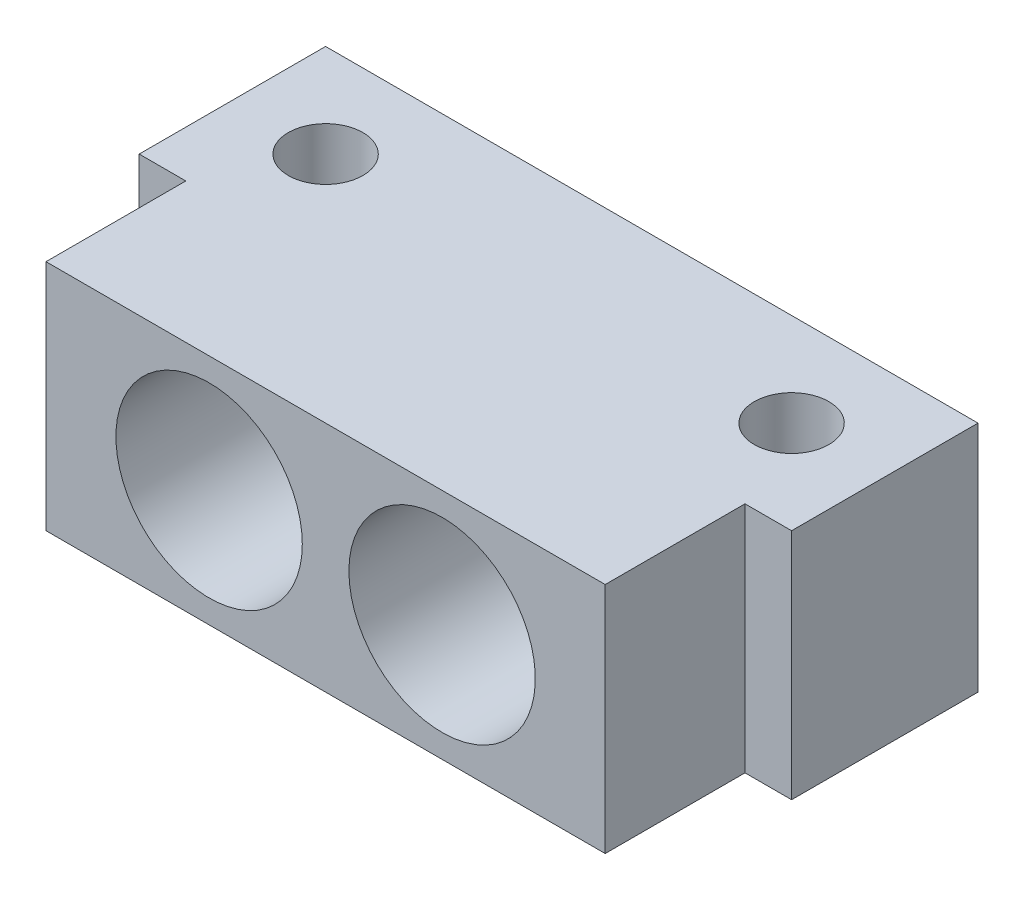
ISO-10303-21;
HEADER;
FILE_DESCRIPTION(('STEP AP214'),'2;1');
FILE_NAME('part.step','',(''),(''),'','','');
FILE_SCHEMA(('AUTOMOTIVE_DESIGN { 1 0 10303 214 1 1 1 1 }'));
ENDSEC;
DATA;
#1=APPLICATION_CONTEXT('core data for automotive mechanical design processes');
#2=APPLICATION_PROTOCOL_DEFINITION('international standard','automotive_design',2000,#1);
#3=PRODUCT_CONTEXT('',#1,'mechanical');
#4=PRODUCT('Part','Part','',(#3));
#5=PRODUCT_RELATED_PRODUCT_CATEGORY('part','',(#4));
#6=PRODUCT_DEFINITION_FORMATION('','',#4);
#7=PRODUCT_DEFINITION_CONTEXT('part definition',#1,'design');
#8=PRODUCT_DEFINITION('design','',#6,#7);
#9=PRODUCT_DEFINITION_SHAPE('','',#8);
#10=(LENGTH_UNIT() NAMED_UNIT(*) SI_UNIT(.MILLI.,.METRE.));
#11=(NAMED_UNIT(*) PLANE_ANGLE_UNIT() SI_UNIT($,.RADIAN.));
#12=(NAMED_UNIT(*) SI_UNIT($,.STERADIAN.) SOLID_ANGLE_UNIT());
#13=UNCERTAINTY_MEASURE_WITH_UNIT(LENGTH_MEASURE(1.E-05),#10,'distance_accuracy_value','');
#14=(GEOMETRIC_REPRESENTATION_CONTEXT(3) GLOBAL_UNCERTAINTY_ASSIGNED_CONTEXT((#13)) GLOBAL_UNIT_ASSIGNED_CONTEXT((#10,
#11,#12)) REPRESENTATION_CONTEXT('',''));
#15=CARTESIAN_POINT('',(0.,0.,0.));
#16=DIRECTION('',(0.,0.,1.));
#17=DIRECTION('',(1.,0.,0.));
#18=AXIS2_PLACEMENT_3D('',#15,#16,#17);
#19=CARTESIAN_POINT('',(0.,25.,0.));
#20=DIRECTION('',(0.,-1.,0.));
#21=DIRECTION('',(0.,0.,-1.));
#22=AXIS2_PLACEMENT_3D('',#19,#20,#21);
#23=PLANE('',#22);
#24=DIRECTION('',(0.,0.,-1.));
#25=VECTOR('',#24,1.);
#26=CARTESIAN_POINT('',(35.,25.,10.));
#27=LINE('',#26,#25);
#28=CARTESIAN_POINT('',(35.,25.,10.));
#29=VERTEX_POINT('',#28);
#30=CARTESIAN_POINT('',(35.,25.,-10.));
#31=VERTEX_POINT('',#30);
#32=EDGE_CURVE('E164',#29,#31,#27,.T.);
#33=ORIENTED_EDGE('',*,*,#32,.T.);
#34=DIRECTION('',(-1.,0.,0.));
#35=VECTOR('',#34,1.);
#36=CARTESIAN_POINT('',(-35.,25.,-10.));
#37=LINE('',#36,#35);
#38=CARTESIAN_POINT('',(-35.,25.,-10.));
#39=VERTEX_POINT('',#38);
#40=EDGE_CURVE('E100',#31,#39,#37,.T.);
#41=ORIENTED_EDGE('',*,*,#40,.T.);
#42=DIRECTION('',(0.,0.,1.));
#43=VECTOR('',#42,1.);
#44=CARTESIAN_POINT('',(-35.,25.,10.));
#45=LINE('',#44,#43);
#46=CARTESIAN_POINT('',(-35.,25.,10.));
#47=VERTEX_POINT('',#46);
#48=EDGE_CURVE('E185',#39,#47,#45,.T.);
#49=ORIENTED_EDGE('',*,*,#48,.T.);
#50=DIRECTION('',(1.,0.,0.));
#51=VECTOR('',#50,1.);
#52=CARTESIAN_POINT('',(-35.,25.,10.));
#53=LINE('',#52,#51);
#54=CARTESIAN_POINT('',(-30.,25.,10.));
#55=VERTEX_POINT('',#54);
#56=EDGE_CURVE('E199',#47,#55,#53,.T.);
#57=ORIENTED_EDGE('',*,*,#56,.T.);
#58=DIRECTION('',(0.,0.,1.));
#59=VECTOR('',#58,1.);
#60=CARTESIAN_POINT('',(-30.,25.,10.));
#61=LINE('',#60,#59);
#62=CARTESIAN_POINT('',(-30.,25.,25.));
#63=VERTEX_POINT('',#62);
#64=EDGE_CURVE('E119',#55,#63,#61,.T.);
#65=ORIENTED_EDGE('',*,*,#64,.T.);
#66=DIRECTION('',(1.,0.,0.));
#67=VECTOR('',#66,1.);
#68=CARTESIAN_POINT('',(-30.,25.,25.));
#69=LINE('',#68,#67);
#70=CARTESIAN_POINT('',(30.,25.,25.));
#71=VERTEX_POINT('',#70);
#72=EDGE_CURVE('E113',#63,#71,#69,.T.);
#73=ORIENTED_EDGE('',*,*,#72,.T.);
#74=DIRECTION('',(0.,0.,-1.));
#75=VECTOR('',#74,1.);
#76=CARTESIAN_POINT('',(30.,25.,10.));
#77=LINE('',#76,#75);
#78=CARTESIAN_POINT('',(30.,25.,10.));
#79=VERTEX_POINT('',#78);
#80=EDGE_CURVE('E117',#71,#79,#77,.T.);
#81=ORIENTED_EDGE('',*,*,#80,.T.);
#82=DIRECTION('',(1.,0.,0.));
#83=VECTOR('',#82,1.);
#84=CARTESIAN_POINT('',(30.,25.,10.));
#85=LINE('',#84,#83);
#86=EDGE_CURVE('E57',#79,#29,#85,.T.);
#87=ORIENTED_EDGE('',*,*,#86,.T.);
#88=EDGE_LOOP('',(#33,#41,#49,#57,#65,#73,#81,#87));
#89=FACE_BOUND('',#88,.T.);
#90=CARTESIAN_POINT('',(-25.,25.,0.));
#91=DIRECTION('',(0.,1.,0.));
#92=DIRECTION('',(0.,0.,1.));
#93=AXIS2_PLACEMENT_3D('',#90,#91,#92);
#94=CIRCLE('',#93,4.);
#95=CARTESIAN_POINT('',(-25.,25.,4.));
#96=VERTEX_POINT('',#95);
#97=EDGE_CURVE('E146',#96,#96,#94,.T.);
#98=ORIENTED_EDGE('',*,*,#97,.F.);
#99=EDGE_LOOP('',(#98));
#100=FACE_BOUND('',#99,.T.);
#101=CARTESIAN_POINT('',(25.,25.,0.));
#102=DIRECTION('',(0.,1.,0.));
#103=DIRECTION('',(0.,0.,-1.));
#104=AXIS2_PLACEMENT_3D('',#101,#102,#103);
#105=CIRCLE('',#104,4.);
#106=CARTESIAN_POINT('',(25.,25.,-4.00000000000001));
#107=VERTEX_POINT('',#106);
#108=EDGE_CURVE('E213',#107,#107,#105,.T.);
#109=ORIENTED_EDGE('',*,*,#108,.F.);
#110=EDGE_LOOP('',(#109));
#111=FACE_BOUND('',#110,.T.);
#112=ADVANCED_FACE('F39',(#89,#100,#111),#23,.F.);
#113=CARTESIAN_POINT('',(0.,0.,0.));
#114=DIRECTION('',(0.,-1.,0.));
#115=DIRECTION('',(0.,0.,-1.));
#116=AXIS2_PLACEMENT_3D('',#113,#114,#115);
#117=PLANE('',#116);
#118=CARTESIAN_POINT('',(-25.,0.,0.));
#119=DIRECTION('',(0.,1.,0.));
#120=DIRECTION('',(0.,0.,1.));
#121=AXIS2_PLACEMENT_3D('',#118,#119,#120);
#122=CIRCLE('',#121,4.);
#123=CARTESIAN_POINT('',(-25.,0.,4.));
#124=VERTEX_POINT('',#123);
#125=EDGE_CURVE('E209',#124,#124,#122,.T.);
#126=ORIENTED_EDGE('',*,*,#125,.T.);
#127=EDGE_LOOP('',(#126));
#128=FACE_BOUND('',#127,.T.);
#129=DIRECTION('',(0.,0.,-1.));
#130=VECTOR('',#129,1.);
#131=CARTESIAN_POINT('',(35.,0.,10.));
#132=LINE('',#131,#130);
#133=CARTESIAN_POINT('',(35.,0.,10.));
#134=VERTEX_POINT('',#133);
#135=CARTESIAN_POINT('',(35.,0.,-10.));
#136=VERTEX_POINT('',#135);
#137=EDGE_CURVE('E141',#134,#136,#132,.T.);
#138=ORIENTED_EDGE('',*,*,#137,.F.);
#139=DIRECTION('',(1.,0.,0.));
#140=VECTOR('',#139,1.);
#141=CARTESIAN_POINT('',(30.,0.,10.));
#142=LINE('',#141,#140);
#143=CARTESIAN_POINT('',(30.,0.,10.));
#144=VERTEX_POINT('',#143);
#145=EDGE_CURVE('E92',#144,#134,#142,.T.);
#146=ORIENTED_EDGE('',*,*,#145,.F.);
#147=DIRECTION('',(0.,0.,-1.));
#148=VECTOR('',#147,1.);
#149=CARTESIAN_POINT('',(30.,0.,10.));
#150=LINE('',#149,#148);
#151=CARTESIAN_POINT('',(30.,0.,25.));
#152=VERTEX_POINT('',#151);
#153=EDGE_CURVE('E86',#152,#144,#150,.T.);
#154=ORIENTED_EDGE('',*,*,#153,.F.);
#155=DIRECTION('',(1.,0.,0.));
#156=VECTOR('',#155,1.);
#157=CARTESIAN_POINT('',(-30.,0.,25.));
#158=LINE('',#157,#156);
#159=CARTESIAN_POINT('',(-30.,0.,25.));
#160=VERTEX_POINT('',#159);
#161=EDGE_CURVE('E128',#160,#152,#158,.T.);
#162=ORIENTED_EDGE('',*,*,#161,.F.);
#163=DIRECTION('',(0.,0.,1.));
#164=VECTOR('',#163,1.);
#165=CARTESIAN_POINT('',(-30.,0.,10.));
#166=LINE('',#165,#164);
#167=CARTESIAN_POINT('',(-30.,0.,10.));
#168=VERTEX_POINT('',#167);
#169=EDGE_CURVE('E155',#168,#160,#166,.T.);
#170=ORIENTED_EDGE('',*,*,#169,.F.);
#171=DIRECTION('',(1.,0.,0.));
#172=VECTOR('',#171,1.);
#173=CARTESIAN_POINT('',(-35.,0.,10.));
#174=LINE('',#173,#172);
#175=CARTESIAN_POINT('',(-35.,0.,10.));
#176=VERTEX_POINT('',#175);
#177=EDGE_CURVE('E152',#176,#168,#174,.T.);
#178=ORIENTED_EDGE('',*,*,#177,.F.);
#179=DIRECTION('',(0.,0.,1.));
#180=VECTOR('',#179,1.);
#181=CARTESIAN_POINT('',(-35.,0.,10.));
#182=LINE('',#181,#180);
#183=CARTESIAN_POINT('',(-35.,0.,-10.));
#184=VERTEX_POINT('',#183);
#185=EDGE_CURVE('E149',#184,#176,#182,.T.);
#186=ORIENTED_EDGE('',*,*,#185,.F.);
#187=DIRECTION('',(-1.,0.,0.));
#188=VECTOR('',#187,1.);
#189=CARTESIAN_POINT('',(-35.,0.,-10.));
#190=LINE('',#189,#188);
#191=EDGE_CURVE('E145',#136,#184,#190,.T.);
#192=ORIENTED_EDGE('',*,*,#191,.F.);
#193=EDGE_LOOP('',(#138,#146,#154,#162,#170,#178,#186,#192));
#194=FACE_BOUND('',#193,.T.);
#195=CARTESIAN_POINT('',(25.,0.,0.));
#196=DIRECTION('',(0.,1.,0.));
#197=DIRECTION('',(0.,0.,-1.));
#198=AXIS2_PLACEMENT_3D('',#195,#196,#197);
#199=CIRCLE('',#198,4.);
#200=CARTESIAN_POINT('',(25.,0.,-4.00000000000001));
#201=VERTEX_POINT('',#200);
#202=EDGE_CURVE('E217',#201,#201,#199,.T.);
#203=ORIENTED_EDGE('',*,*,#202,.T.);
#204=EDGE_LOOP('',(#203));
#205=FACE_BOUND('',#204,.T.);
#206=ADVANCED_FACE('F189',(#128,#194,#205),#117,.T.);
#207=CARTESIAN_POINT('',(35.,25.,10.));
#208=DIRECTION('',(-1.,0.,0.));
#209=DIRECTION('',(0.,0.,1.));
#210=AXIS2_PLACEMENT_3D('',#207,#208,#209);
#211=PLANE('',#210);
#212=ORIENTED_EDGE('',*,*,#137,.T.);
#213=DIRECTION('',(0.,-1.,0.));
#214=VECTOR('',#213,1.);
#215=CARTESIAN_POINT('',(35.,25.,-10.));
#216=LINE('',#215,#214);
#217=EDGE_CURVE('E11',#31,#136,#216,.T.);
#218=ORIENTED_EDGE('',*,*,#217,.F.);
#219=ORIENTED_EDGE('',*,*,#32,.F.);
#220=DIRECTION('',(0.,-1.,0.));
#221=VECTOR('',#220,1.);
#222=CARTESIAN_POINT('',(35.,25.,10.));
#223=LINE('',#222,#221);
#224=EDGE_CURVE('E137',#29,#134,#223,.T.);
#225=ORIENTED_EDGE('',*,*,#224,.T.);
#226=EDGE_LOOP('',(#212,#218,#219,#225));
#227=FACE_BOUND('',#226,.T.);
#228=ADVANCED_FACE('F41',(#227),#211,.F.);
#229=CARTESIAN_POINT('',(-35.,25.,-10.));
#230=DIRECTION('',(0.,0.,1.));
#231=DIRECTION('',(1.,0.,0.));
#232=AXIS2_PLACEMENT_3D('',#229,#230,#231);
#233=PLANE('',#232);
#234=ORIENTED_EDGE('',*,*,#191,.T.);
#235=DIRECTION('',(0.,-1.,0.));
#236=VECTOR('',#235,1.);
#237=CARTESIAN_POINT('',(-35.,25.,-10.));
#238=LINE('',#237,#236);
#239=EDGE_CURVE('E49',#39,#184,#238,.T.);
#240=ORIENTED_EDGE('',*,*,#239,.F.);
#241=ORIENTED_EDGE('',*,*,#40,.F.);
#242=ORIENTED_EDGE('',*,*,#217,.T.);
#243=EDGE_LOOP('',(#234,#240,#241,#242));
#244=FACE_BOUND('',#243,.T.);
#245=ADVANCED_FACE('F289',(#244),#233,.F.);
#246=CARTESIAN_POINT('',(-35.,25.,10.));
#247=DIRECTION('',(1.,0.,0.));
#248=DIRECTION('',(0.,0.,-1.));
#249=AXIS2_PLACEMENT_3D('',#246,#247,#248);
#250=PLANE('',#249);
#251=ORIENTED_EDGE('',*,*,#185,.T.);
#252=DIRECTION('',(0.,-1.,0.));
#253=VECTOR('',#252,1.);
#254=CARTESIAN_POINT('',(-35.,25.,10.));
#255=LINE('',#254,#253);
#256=EDGE_CURVE('E175',#47,#176,#255,.T.);
#257=ORIENTED_EDGE('',*,*,#256,.F.);
#258=ORIENTED_EDGE('',*,*,#48,.F.);
#259=ORIENTED_EDGE('',*,*,#239,.T.);
#260=EDGE_LOOP('',(#251,#257,#258,#259));
#261=FACE_BOUND('',#260,.T.);
#262=ADVANCED_FACE('F183',(#261),#250,.F.);
#263=CARTESIAN_POINT('',(-35.,25.,10.));
#264=DIRECTION('',(0.,0.,-1.));
#265=DIRECTION('',(-1.,0.,0.));
#266=AXIS2_PLACEMENT_3D('',#263,#264,#265);
#267=PLANE('',#266);
#268=ORIENTED_EDGE('',*,*,#177,.T.);
#269=DIRECTION('',(0.,-1.,0.));
#270=VECTOR('',#269,1.);
#271=CARTESIAN_POINT('',(-30.,25.,10.));
#272=LINE('',#271,#270);
#273=EDGE_CURVE('E171',#55,#168,#272,.T.);
#274=ORIENTED_EDGE('',*,*,#273,.F.);
#275=ORIENTED_EDGE('',*,*,#56,.F.);
#276=ORIENTED_EDGE('',*,*,#256,.T.);
#277=EDGE_LOOP('',(#268,#274,#275,#276));
#278=FACE_BOUND('',#277,.T.);
#279=ADVANCED_FACE('F194',(#278),#267,.F.);
#280=CARTESIAN_POINT('',(-30.,25.,10.));
#281=DIRECTION('',(1.,0.,0.));
#282=DIRECTION('',(0.,0.,-1.));
#283=AXIS2_PLACEMENT_3D('',#280,#281,#282);
#284=PLANE('',#283);
#285=ORIENTED_EDGE('',*,*,#169,.T.);
#286=DIRECTION('',(0.,-1.,0.));
#287=VECTOR('',#286,1.);
#288=CARTESIAN_POINT('',(-30.,25.,25.));
#289=LINE('',#288,#287);
#290=EDGE_CURVE('E130',#63,#160,#289,.T.);
#291=ORIENTED_EDGE('',*,*,#290,.F.);
#292=ORIENTED_EDGE('',*,*,#64,.F.);
#293=ORIENTED_EDGE('',*,*,#273,.T.);
#294=EDGE_LOOP('',(#285,#291,#292,#293));
#295=FACE_BOUND('',#294,.T.);
#296=ADVANCED_FACE('F197',(#295),#284,.F.);
#297=CARTESIAN_POINT('',(-30.,25.,25.));
#298=DIRECTION('',(0.,0.,-1.));
#299=DIRECTION('',(-1.,0.,0.));
#300=AXIS2_PLACEMENT_3D('',#297,#298,#299);
#301=PLANE('',#300);
#302=CARTESIAN_POINT('',(-12.5,12.5,25.));
#303=DIRECTION('',(0.,0.,1.));
#304=DIRECTION('',(1.,0.,0.));
#305=AXIS2_PLACEMENT_3D('',#302,#303,#304);
#306=CIRCLE('',#305,10.);
#307=CARTESIAN_POINT('',(-2.5,12.5,25.));
#308=VERTEX_POINT('',#307);
#309=EDGE_CURVE('E233',#308,#308,#306,.T.);
#310=ORIENTED_EDGE('',*,*,#309,.F.);
#311=EDGE_LOOP('',(#310));
#312=FACE_BOUND('',#311,.T.);
#313=CARTESIAN_POINT('',(12.5,12.5,25.));
#314=DIRECTION('',(0.,0.,1.));
#315=DIRECTION('',(-1.,0.,0.));
#316=AXIS2_PLACEMENT_3D('',#313,#314,#315);
#317=CIRCLE('',#316,10.);
#318=CARTESIAN_POINT('',(2.5,12.5,25.));
#319=VERTEX_POINT('',#318);
#320=EDGE_CURVE('E225',#319,#319,#317,.T.);
#321=ORIENTED_EDGE('',*,*,#320,.F.);
#322=EDGE_LOOP('',(#321));
#323=FACE_BOUND('',#322,.T.);
#324=ORIENTED_EDGE('',*,*,#161,.T.);
#325=DIRECTION('',(0.,-1.,0.));
#326=VECTOR('',#325,1.);
#327=CARTESIAN_POINT('',(30.,25.,25.));
#328=LINE('',#327,#326);
#329=EDGE_CURVE('E125',#71,#152,#328,.T.);
#330=ORIENTED_EDGE('',*,*,#329,.F.);
#331=ORIENTED_EDGE('',*,*,#72,.F.);
#332=ORIENTED_EDGE('',*,*,#290,.T.);
#333=EDGE_LOOP('',(#324,#330,#331,#332));
#334=FACE_BOUND('',#333,.T.);
#335=ADVANCED_FACE('F126',(#312,#323,#334),#301,.F.);
#336=CARTESIAN_POINT('',(30.,25.,10.));
#337=DIRECTION('',(-1.,0.,0.));
#338=DIRECTION('',(0.,0.,1.));
#339=AXIS2_PLACEMENT_3D('',#336,#337,#338);
#340=PLANE('',#339);
#341=ORIENTED_EDGE('',*,*,#153,.T.);
#342=DIRECTION('',(0.,-1.,0.));
#343=VECTOR('',#342,1.);
#344=CARTESIAN_POINT('',(30.,25.,10.));
#345=LINE('',#344,#343);
#346=EDGE_CURVE('E131',#79,#144,#345,.T.);
#347=ORIENTED_EDGE('',*,*,#346,.F.);
#348=ORIENTED_EDGE('',*,*,#80,.F.);
#349=ORIENTED_EDGE('',*,*,#329,.T.);
#350=EDGE_LOOP('',(#341,#347,#348,#349));
#351=FACE_BOUND('',#350,.T.);
#352=ADVANCED_FACE('F133',(#351),#340,.F.);
#353=CARTESIAN_POINT('',(30.,25.,10.));
#354=DIRECTION('',(0.,0.,-1.));
#355=DIRECTION('',(-1.,0.,0.));
#356=AXIS2_PLACEMENT_3D('',#353,#354,#355);
#357=PLANE('',#356);
#358=ORIENTED_EDGE('',*,*,#145,.T.);
#359=ORIENTED_EDGE('',*,*,#224,.F.);
#360=ORIENTED_EDGE('',*,*,#86,.F.);
#361=ORIENTED_EDGE('',*,*,#346,.T.);
#362=EDGE_LOOP('',(#358,#359,#360,#361));
#363=FACE_BOUND('',#362,.T.);
#364=ADVANCED_FACE('F279',(#363),#357,.F.);
#365=CARTESIAN_POINT('',(-25.,25.,0.));
#366=DIRECTION('',(0.,-1.,0.));
#367=DIRECTION('',(0.,0.,-1.));
#368=AXIS2_PLACEMENT_3D('',#365,#366,#367);
#369=CYLINDRICAL_SURFACE('',#368,4.);
#370=ORIENTED_EDGE('',*,*,#97,.T.);
#371=EDGE_LOOP('',(#370));
#372=FACE_BOUND('',#371,.T.);
#373=ORIENTED_EDGE('',*,*,#125,.F.);
#374=EDGE_LOOP('',(#373));
#375=FACE_BOUND('',#374,.T.);
#376=ADVANCED_FACE('F266',(#372,#375),#369,.F.);
#377=CARTESIAN_POINT('',(25.,25.,0.));
#378=DIRECTION('',(0.,-1.,0.));
#379=DIRECTION('',(0.,0.,-1.));
#380=AXIS2_PLACEMENT_3D('',#377,#378,#379);
#381=CYLINDRICAL_SURFACE('',#380,4.);
#382=ORIENTED_EDGE('',*,*,#108,.T.);
#383=EDGE_LOOP('',(#382));
#384=FACE_BOUND('',#383,.T.);
#385=ORIENTED_EDGE('',*,*,#202,.F.);
#386=EDGE_LOOP('',(#385));
#387=FACE_BOUND('',#386,.T.);
#388=ADVANCED_FACE('F257',(#384,#387),#381,.F.);
#389=CARTESIAN_POINT('',(12.5,12.5,10.));
#390=DIRECTION('',(0.,0.,1.));
#391=DIRECTION('',(1.,0.,0.));
#392=AXIS2_PLACEMENT_3D('',#389,#390,#391);
#393=CYLINDRICAL_SURFACE('',#392,10.);
#394=CARTESIAN_POINT('',(12.5,12.5,10.));
#395=DIRECTION('',(0.,0.,1.));
#396=DIRECTION('',(-1.,0.,0.));
#397=AXIS2_PLACEMENT_3D('',#394,#395,#396);
#398=CIRCLE('',#397,10.);
#399=CARTESIAN_POINT('',(2.5,12.5,10.));
#400=VERTEX_POINT('',#399);
#401=EDGE_CURVE('E229',#400,#400,#398,.T.);
#402=ORIENTED_EDGE('',*,*,#401,.F.);
#403=EDGE_LOOP('',(#402));
#404=FACE_BOUND('',#403,.T.);
#405=ORIENTED_EDGE('',*,*,#320,.T.);
#406=EDGE_LOOP('',(#405));
#407=FACE_BOUND('',#406,.T.);
#408=ADVANCED_FACE('F255',(#404,#407),#393,.F.);
#409=CARTESIAN_POINT('',(12.5,12.5,10.));
#410=DIRECTION('',(0.,0.,-1.));
#411=DIRECTION('',(-1.,0.,0.));
#412=AXIS2_PLACEMENT_3D('',#409,#410,#411);
#413=PLANE('',#412);
#414=ORIENTED_EDGE('',*,*,#401,.T.);
#415=EDGE_LOOP('',(#414));
#416=FACE_BOUND('',#415,.T.);
#417=ADVANCED_FACE('F246',(#416),#413,.F.);
#418=CARTESIAN_POINT('',(-12.5,12.5,10.));
#419=DIRECTION('',(0.,0.,1.));
#420=DIRECTION('',(1.,0.,0.));
#421=AXIS2_PLACEMENT_3D('',#418,#419,#420);
#422=CYLINDRICAL_SURFACE('',#421,10.);
#423=CARTESIAN_POINT('',(-12.5,12.5,10.));
#424=DIRECTION('',(0.,0.,1.));
#425=DIRECTION('',(1.,0.,0.));
#426=AXIS2_PLACEMENT_3D('',#423,#424,#425);
#427=CIRCLE('',#426,10.);
#428=CARTESIAN_POINT('',(-2.5,12.5,10.));
#429=VERTEX_POINT('',#428);
#430=EDGE_CURVE('E221',#429,#429,#427,.T.);
#431=ORIENTED_EDGE('',*,*,#430,.F.);
#432=EDGE_LOOP('',(#431));
#433=FACE_BOUND('',#432,.T.);
#434=ORIENTED_EDGE('',*,*,#309,.T.);
#435=EDGE_LOOP('',(#434));
#436=FACE_BOUND('',#435,.T.);
#437=ADVANCED_FACE('F243',(#433,#436),#422,.F.);
#438=CARTESIAN_POINT('',(-12.5,12.5,10.));
#439=DIRECTION('',(0.,0.,1.));
#440=DIRECTION('',(1.,0.,0.));
#441=AXIS2_PLACEMENT_3D('',#438,#439,#440);
#442=PLANE('',#441);
#443=ORIENTED_EDGE('',*,*,#430,.T.);
#444=EDGE_LOOP('',(#443));
#445=FACE_BOUND('',#444,.T.);
#446=ADVANCED_FACE('F241',(#445),#442,.T.);
#447=CLOSED_SHELL('',(#112,#206,#228,#245,#262,#279,#296,#335,#352,#364,#376,#388,#408,#417,
#437,#446));
#448=MANIFOLD_SOLID_BREP('B2',#447);
#449=ADVANCED_BREP_SHAPE_REPRESENTATION('',(#18,#448),#14);
#450=SHAPE_DEFINITION_REPRESENTATION(#9,#449);
ENDSEC;
END-ISO-10303-21;
